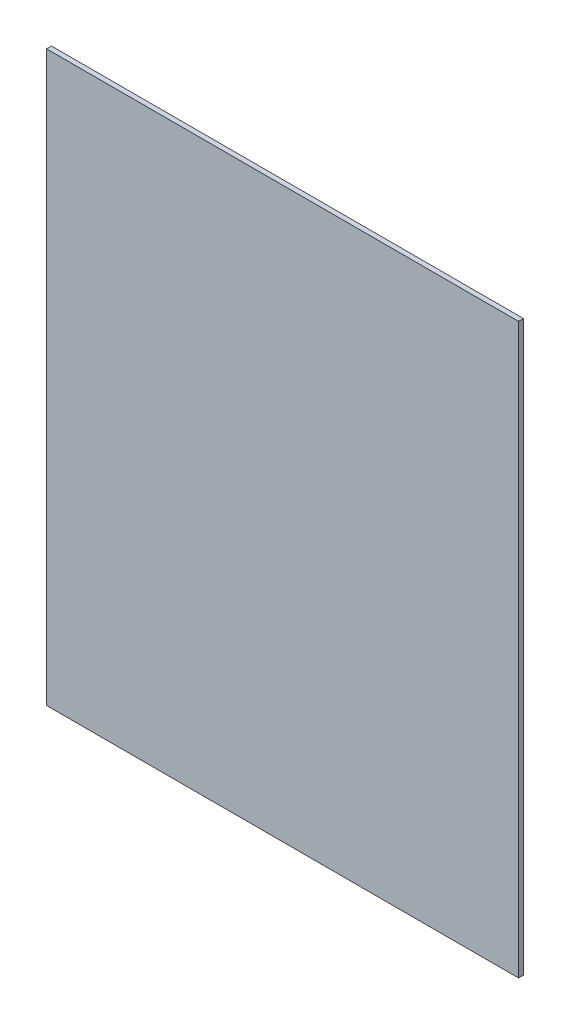
ISO-10303-21;
HEADER;
FILE_DESCRIPTION(('STEP AP214'),'2;1');
FILE_NAME('part.step','',(''),(''),'','','');
FILE_SCHEMA(('AUTOMOTIVE_DESIGN { 1 0 10303 214 1 1 1 1 }'));
ENDSEC;
DATA;
#1=APPLICATION_CONTEXT('core data for automotive mechanical design processes');
#2=APPLICATION_PROTOCOL_DEFINITION('international standard','automotive_design',2000,#1);
#3=PRODUCT_CONTEXT('',#1,'mechanical');
#4=PRODUCT('Part','Part','',(#3));
#5=PRODUCT_RELATED_PRODUCT_CATEGORY('part','',(#4));
#6=PRODUCT_DEFINITION_FORMATION('','',#4);
#7=PRODUCT_DEFINITION_CONTEXT('part definition',#1,'design');
#8=PRODUCT_DEFINITION('design','',#6,#7);
#9=PRODUCT_DEFINITION_SHAPE('','',#8);
#10=(LENGTH_UNIT() NAMED_UNIT(*) SI_UNIT(.MILLI.,.METRE.));
#11=(NAMED_UNIT(*) PLANE_ANGLE_UNIT() SI_UNIT($,.RADIAN.));
#12=(NAMED_UNIT(*) SI_UNIT($,.STERADIAN.) SOLID_ANGLE_UNIT());
#13=UNCERTAINTY_MEASURE_WITH_UNIT(LENGTH_MEASURE(1.E-05),#10,'distance_accuracy_value','');
#14=(GEOMETRIC_REPRESENTATION_CONTEXT(3) GLOBAL_UNCERTAINTY_ASSIGNED_CONTEXT((#13)) GLOBAL_UNIT_ASSIGNED_CONTEXT((#10,
#11,#12)) REPRESENTATION_CONTEXT('',''));
#15=CARTESIAN_POINT('',(0.,0.,0.));
#16=DIRECTION('',(0.,0.,1.));
#17=DIRECTION('',(1.,0.,0.));
#18=AXIS2_PLACEMENT_3D('',#15,#16,#17);
#19=CARTESIAN_POINT('',(312.5,-376.5,6.5));
#20=DIRECTION('',(-1.,0.,0.));
#21=DIRECTION('',(0.,0.,1.));
#22=AXIS2_PLACEMENT_3D('',#19,#20,#21);
#23=PLANE('',#22);
#24=DIRECTION('',(0.,1.,0.));
#25=VECTOR('',#24,1.);
#26=CARTESIAN_POINT('',(312.5,-376.5,0.));
#27=LINE('',#26,#25);
#28=CARTESIAN_POINT('',(312.5,-376.5,0.));
#29=VERTEX_POINT('',#28);
#30=CARTESIAN_POINT('',(312.5,376.5,0.));
#31=VERTEX_POINT('',#30);
#32=EDGE_CURVE('E95',#29,#31,#27,.T.);
#33=ORIENTED_EDGE('',*,*,#32,.T.);
#34=DIRECTION('',(0.,0.,-1.));
#35=VECTOR('',#34,1.);
#36=CARTESIAN_POINT('',(312.5,376.5,6.5));
#37=LINE('',#36,#35);
#38=CARTESIAN_POINT('',(312.5,376.5,6.5));
#39=VERTEX_POINT('',#38);
#40=EDGE_CURVE('E11',#39,#31,#37,.T.);
#41=ORIENTED_EDGE('',*,*,#40,.F.);
#42=DIRECTION('',(0.,1.,0.));
#43=VECTOR('',#42,1.);
#44=CARTESIAN_POINT('',(312.5,-376.5,6.5));
#45=LINE('',#44,#43);
#46=CARTESIAN_POINT('',(312.5,-376.5,6.5));
#47=VERTEX_POINT('',#46);
#48=EDGE_CURVE('E83',#47,#39,#45,.T.);
#49=ORIENTED_EDGE('',*,*,#48,.F.);
#50=DIRECTION('',(0.,0.,-1.));
#51=VECTOR('',#50,1.);
#52=CARTESIAN_POINT('',(312.5,-376.5,6.5));
#53=LINE('',#52,#51);
#54=EDGE_CURVE('E91',#47,#29,#53,.T.);
#55=ORIENTED_EDGE('',*,*,#54,.T.);
#56=EDGE_LOOP('',(#33,#41,#49,#55));
#57=FACE_BOUND('',#56,.T.);
#58=ADVANCED_FACE('F32',(#57),#23,.F.);
#59=CARTESIAN_POINT('',(-312.5,376.5,6.5));
#60=DIRECTION('',(0.,-1.,0.));
#61=DIRECTION('',(0.,0.,-1.));
#62=AXIS2_PLACEMENT_3D('',#59,#60,#61);
#63=PLANE('',#62);
#64=DIRECTION('',(-1.,0.,0.));
#65=VECTOR('',#64,1.);
#66=CARTESIAN_POINT('',(-312.5,376.5,0.));
#67=LINE('',#66,#65);
#68=CARTESIAN_POINT('',(-312.5,376.5,0.));
#69=VERTEX_POINT('',#68);
#70=EDGE_CURVE('E87',#31,#69,#67,.T.);
#71=ORIENTED_EDGE('',*,*,#70,.T.);
#72=DIRECTION('',(0.,0.,-1.));
#73=VECTOR('',#72,1.);
#74=CARTESIAN_POINT('',(-312.5,376.5,6.5));
#75=LINE('',#74,#73);
#76=CARTESIAN_POINT('',(-312.5,376.5,6.5));
#77=VERTEX_POINT('',#76);
#78=EDGE_CURVE('E40',#77,#69,#75,.T.);
#79=ORIENTED_EDGE('',*,*,#78,.F.);
#80=DIRECTION('',(-1.,0.,0.));
#81=VECTOR('',#80,1.);
#82=CARTESIAN_POINT('',(-312.5,376.5,6.5));
#83=LINE('',#82,#81);
#84=EDGE_CURVE('E78',#39,#77,#83,.T.);
#85=ORIENTED_EDGE('',*,*,#84,.F.);
#86=ORIENTED_EDGE('',*,*,#40,.T.);
#87=EDGE_LOOP('',(#71,#79,#85,#86));
#88=FACE_BOUND('',#87,.T.);
#89=ADVANCED_FACE('F86',(#88),#63,.F.);
#90=CARTESIAN_POINT('',(-312.5,-376.5,6.5));
#91=DIRECTION('',(1.,0.,0.));
#92=DIRECTION('',(0.,0.,-1.));
#93=AXIS2_PLACEMENT_3D('',#90,#91,#92);
#94=PLANE('',#93);
#95=DIRECTION('',(0.,-1.,0.));
#96=VECTOR('',#95,1.);
#97=CARTESIAN_POINT('',(-312.5,-376.5,0.));
#98=LINE('',#97,#96);
#99=CARTESIAN_POINT('',(-312.5,-376.5,0.));
#100=VERTEX_POINT('',#99);
#101=EDGE_CURVE('E65',#69,#100,#98,.T.);
#102=ORIENTED_EDGE('',*,*,#101,.T.);
#103=DIRECTION('',(0.,0.,-1.));
#104=VECTOR('',#103,1.);
#105=CARTESIAN_POINT('',(-312.5,-376.5,6.5));
#106=LINE('',#105,#104);
#107=CARTESIAN_POINT('',(-312.5,-376.5,6.5));
#108=VERTEX_POINT('',#107);
#109=EDGE_CURVE('E88',#108,#100,#106,.T.);
#110=ORIENTED_EDGE('',*,*,#109,.F.);
#111=DIRECTION('',(0.,-1.,0.));
#112=VECTOR('',#111,1.);
#113=CARTESIAN_POINT('',(-312.5,-376.5,6.5));
#114=LINE('',#113,#112);
#115=EDGE_CURVE('E81',#77,#108,#114,.T.);
#116=ORIENTED_EDGE('',*,*,#115,.F.);
#117=ORIENTED_EDGE('',*,*,#78,.T.);
#118=EDGE_LOOP('',(#102,#110,#116,#117));
#119=FACE_BOUND('',#118,.T.);
#120=ADVANCED_FACE('F89',(#119),#94,.F.);
#121=CARTESIAN_POINT('',(-312.5,-376.5,6.5));
#122=DIRECTION('',(0.,1.,0.));
#123=DIRECTION('',(0.,0.,1.));
#124=AXIS2_PLACEMENT_3D('',#121,#122,#123);
#125=PLANE('',#124);
#126=DIRECTION('',(1.,0.,0.));
#127=VECTOR('',#126,1.);
#128=CARTESIAN_POINT('',(-312.5,-376.5,0.));
#129=LINE('',#128,#127);
#130=EDGE_CURVE('E71',#100,#29,#129,.T.);
#131=ORIENTED_EDGE('',*,*,#130,.T.);
#132=ORIENTED_EDGE('',*,*,#54,.F.);
#133=DIRECTION('',(1.,0.,0.));
#134=VECTOR('',#133,1.);
#135=CARTESIAN_POINT('',(-312.5,-376.5,6.5));
#136=LINE('',#135,#134);
#137=EDGE_CURVE('E48',#108,#47,#136,.T.);
#138=ORIENTED_EDGE('',*,*,#137,.F.);
#139=ORIENTED_EDGE('',*,*,#109,.T.);
#140=EDGE_LOOP('',(#131,#132,#138,#139));
#141=FACE_BOUND('',#140,.T.);
#142=ADVANCED_FACE('F102',(#141),#125,.F.);
#143=CARTESIAN_POINT('',(0.,0.,6.5));
#144=DIRECTION('',(0.,0.,-1.));
#145=DIRECTION('',(-1.,0.,0.));
#146=AXIS2_PLACEMENT_3D('',#143,#144,#145);
#147=PLANE('',#146);
#148=ORIENTED_EDGE('',*,*,#48,.T.);
#149=ORIENTED_EDGE('',*,*,#84,.T.);
#150=ORIENTED_EDGE('',*,*,#115,.T.);
#151=ORIENTED_EDGE('',*,*,#137,.T.);
#152=EDGE_LOOP('',(#148,#149,#150,#151));
#153=FACE_BOUND('',#152,.T.);
#154=ADVANCED_FACE('F79',(#153),#147,.F.);
#155=CARTESIAN_POINT('',(0.,0.,0.));
#156=DIRECTION('',(0.,0.,-1.));
#157=DIRECTION('',(-1.,0.,0.));
#158=AXIS2_PLACEMENT_3D('',#155,#156,#157);
#159=PLANE('',#158);
#160=ORIENTED_EDGE('',*,*,#32,.F.);
#161=ORIENTED_EDGE('',*,*,#130,.F.);
#162=ORIENTED_EDGE('',*,*,#101,.F.);
#163=ORIENTED_EDGE('',*,*,#70,.F.);
#164=EDGE_LOOP('',(#160,#161,#162,#163));
#165=FACE_BOUND('',#164,.T.);
#166=ADVANCED_FACE('F105',(#165),#159,.T.);
#167=CLOSED_SHELL('',(#58,#89,#120,#142,#154,#166));
#168=MANIFOLD_SOLID_BREP('B2',#167);
#169=ADVANCED_BREP_SHAPE_REPRESENTATION('',(#18,#168),#14);
#170=SHAPE_DEFINITION_REPRESENTATION(#9,#169);
ENDSEC;
END-ISO-10303-21;
